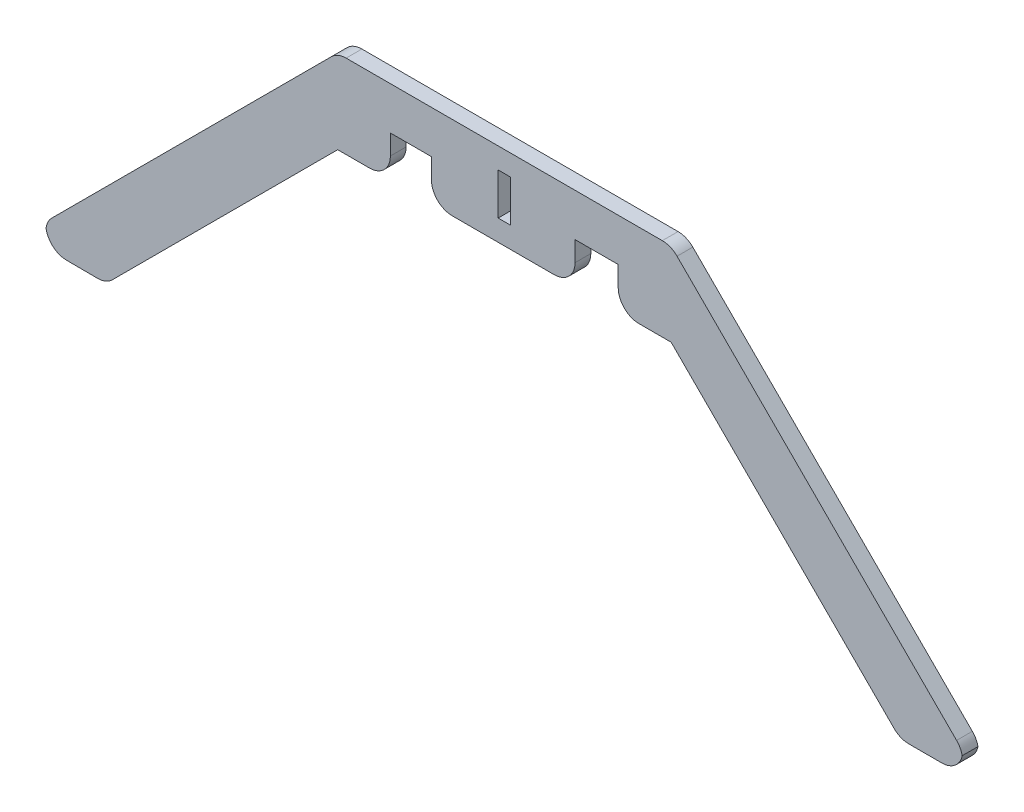
ISO-10303-21;
HEADER;
FILE_DESCRIPTION(('STEP AP214'),'2;1');
FILE_NAME('part.step','',(''),(''),'','','');
FILE_SCHEMA(('AUTOMOTIVE_DESIGN { 1 0 10303 214 1 1 1 1 }'));
ENDSEC;
DATA;
#1=APPLICATION_CONTEXT('core data for automotive mechanical design processes');
#2=APPLICATION_PROTOCOL_DEFINITION('international standard','automotive_design',2000,#1);
#3=PRODUCT_CONTEXT('',#1,'mechanical');
#4=PRODUCT('Part','Part','',(#3));
#5=PRODUCT_RELATED_PRODUCT_CATEGORY('part','',(#4));
#6=PRODUCT_DEFINITION_FORMATION('','',#4);
#7=PRODUCT_DEFINITION_CONTEXT('part definition',#1,'design');
#8=PRODUCT_DEFINITION('design','',#6,#7);
#9=PRODUCT_DEFINITION_SHAPE('','',#8);
#10=(LENGTH_UNIT() NAMED_UNIT(*) SI_UNIT(.MILLI.,.METRE.));
#11=(NAMED_UNIT(*) PLANE_ANGLE_UNIT() SI_UNIT($,.RADIAN.));
#12=(NAMED_UNIT(*) SI_UNIT($,.STERADIAN.) SOLID_ANGLE_UNIT());
#13=UNCERTAINTY_MEASURE_WITH_UNIT(LENGTH_MEASURE(1.E-05),#10,'distance_accuracy_value','');
#14=(GEOMETRIC_REPRESENTATION_CONTEXT(3) GLOBAL_UNCERTAINTY_ASSIGNED_CONTEXT((#13)) GLOBAL_UNIT_ASSIGNED_CONTEXT((#10,
#11,#12)) REPRESENTATION_CONTEXT('',''));
#15=CARTESIAN_POINT('',(0.,0.,0.));
#16=DIRECTION('',(0.,0.,1.));
#17=DIRECTION('',(1.,0.,0.));
#18=AXIS2_PLACEMENT_3D('',#15,#16,#17);
#19=CARTESIAN_POINT('',(0.,0.,4.800000052));
#20=DIRECTION('',(0.,0.,-1.));
#21=DIRECTION('',(-1.,0.,0.));
#22=AXIS2_PLACEMENT_3D('',#19,#20,#21);
#23=PLANE('',#22);
#24=DIRECTION('',(1.,0.,0.));
#25=VECTOR('',#24,1.);
#26=CARTESIAN_POINT('',(0.,143.270265090096,4.800000052));
#27=LINE('',#26,#25);
#28=CARTESIAN_POINT('',(88.9574174696608,143.270265090096,4.800000052));
#29=VERTEX_POINT('',#28);
#30=CARTESIAN_POINT('',(98.6510949411396,143.270265090096,4.800000052));
#31=VERTEX_POINT('',#30);
#32=EDGE_CURVE('E412',#29,#31,#27,.T.);
#33=ORIENTED_EDGE('',*,*,#32,.T.);
#34=CARTESIAN_POINT('',(98.6510949411396,149.620265090096,4.800000052));
#35=DIRECTION('',(0.,0.,-1.));
#36=DIRECTION('',(-1.,0.,0.));
#37=AXIS2_PLACEMENT_3D('',#34,#35,#36);
#38=CIRCLE('',#37,6.35);
#39=CARTESIAN_POINT('',(105.00109494114,149.620265090096,4.800000052));
#40=VERTEX_POINT('',#39);
#41=EDGE_CURVE('E408',#31,#40,#38,.F.);
#42=ORIENTED_EDGE('',*,*,#41,.T.);
#43=DIRECTION('',(0.,1.,0.));
#44=VECTOR('',#43,1.);
#45=CARTESIAN_POINT('',(105.00109494114,0.,4.800000052));
#46=LINE('',#45,#44);
#47=CARTESIAN_POINT('',(105.00109494114,155.712820870524,4.800000052));
#48=VERTEX_POINT('',#47);
#49=EDGE_CURVE('E400',#40,#48,#46,.T.);
#50=ORIENTED_EDGE('',*,*,#49,.T.);
#51=DIRECTION('',(1.,0.,0.));
#52=VECTOR('',#51,1.);
#53=CARTESIAN_POINT('',(0.,155.712820870524,4.800000052));
#54=LINE('',#53,#52);
#55=CARTESIAN_POINT('',(117.513728436182,155.712820870524,4.800000052));
#56=VERTEX_POINT('',#55);
#57=EDGE_CURVE('E406',#48,#56,#54,.T.);
#58=ORIENTED_EDGE('',*,*,#57,.T.);
#59=DIRECTION('',(0.,1.,0.));
#60=VECTOR('',#59,1.);
#61=CARTESIAN_POINT('',(117.513728436182,-1.31068778514753E-13,4.800000052));
#62=LINE('',#61,#60);
#63=CARTESIAN_POINT('',(117.513728436182,149.620265090096,4.800000052));
#64=VERTEX_POINT('',#63);
#65=EDGE_CURVE('E428',#64,#56,#62,.T.);
#66=ORIENTED_EDGE('',*,*,#65,.F.);
#67=CARTESIAN_POINT('',(123.863728436182,149.620265090096,4.800000052));
#68=DIRECTION('',(0.,0.,-1.));
#69=DIRECTION('',(-1.,0.,0.));
#70=AXIS2_PLACEMENT_3D('',#67,#68,#69);
#71=CIRCLE('',#70,6.35);
#72=CARTESIAN_POINT('',(123.863728436182,143.270265090096,4.800000052));
#73=VERTEX_POINT('',#72);
#74=EDGE_CURVE('E589',#64,#73,#71,.F.);
#75=ORIENTED_EDGE('',*,*,#74,.T.);
#76=CARTESIAN_POINT('',(154.93323771039,143.270265090096,4.800000052));
#77=VERTEX_POINT('',#76);
#78=EDGE_CURVE('E430',#73,#77,#27,.T.);
#79=ORIENTED_EDGE('',*,*,#78,.T.);
#80=CARTESIAN_POINT('',(154.93323771039,149.620265090096,4.800000052));
#81=DIRECTION('',(0.,0.,-1.));
#82=DIRECTION('',(-1.,0.,0.));
#83=AXIS2_PLACEMENT_3D('',#80,#81,#82);
#84=CIRCLE('',#83,6.35);
#85=CARTESIAN_POINT('',(161.28323771039,149.620265090096,4.800000052));
#86=VERTEX_POINT('',#85);
#87=EDGE_CURVE('E587',#77,#86,#84,.F.);
#88=ORIENTED_EDGE('',*,*,#87,.T.);
#89=DIRECTION('',(0.,1.,0.));
#90=VECTOR('',#89,1.);
#91=CARTESIAN_POINT('',(161.28323771039,0.,4.800000052));
#92=LINE('',#91,#90);
#93=CARTESIAN_POINT('',(161.28323771039,155.712820870524,4.800000052));
#94=VERTEX_POINT('',#93);
#95=EDGE_CURVE('E434',#86,#94,#92,.T.);
#96=ORIENTED_EDGE('',*,*,#95,.T.);
#97=DIRECTION('',(1.,0.,0.));
#98=VECTOR('',#97,1.);
#99=CARTESIAN_POINT('',(0.,155.712820870524,4.800000052));
#100=LINE('',#99,#98);
#101=CARTESIAN_POINT('',(174.431585666931,155.712820870524,4.800000052));
#102=VERTEX_POINT('',#101);
#103=EDGE_CURVE('E436',#94,#102,#100,.T.);
#104=ORIENTED_EDGE('',*,*,#103,.T.);
#105=DIRECTION('',(0.,1.,0.));
#106=VECTOR('',#105,1.);
#107=CARTESIAN_POINT('',(174.431585666932,3.89104067618317E-13,4.800000052));
#108=LINE('',#107,#106);
#109=CARTESIAN_POINT('',(174.431585666931,149.620265090096,4.800000052));
#110=VERTEX_POINT('',#109);
#111=EDGE_CURVE('E439',#110,#102,#108,.T.);
#112=ORIENTED_EDGE('',*,*,#111,.F.);
#113=CARTESIAN_POINT('',(180.781585666931,149.620265090096,4.800000052));
#114=DIRECTION('',(0.,0.,-1.));
#115=DIRECTION('',(-1.,0.,0.));
#116=AXIS2_PLACEMENT_3D('',#113,#114,#115);
#117=CIRCLE('',#116,6.35);
#118=CARTESIAN_POINT('',(180.781585666931,143.270265090096,4.800000052));
#119=VERTEX_POINT('',#118);
#120=EDGE_CURVE('E585',#110,#119,#117,.F.);
#121=ORIENTED_EDGE('',*,*,#120,.T.);
#122=CARTESIAN_POINT('',(190.557417469661,143.270265090096,4.800000052));
#123=VERTEX_POINT('',#122);
#124=EDGE_CURVE('E441',#119,#123,#27,.T.);
#125=ORIENTED_EDGE('',*,*,#124,.T.);
#126=DIRECTION('',(0.707106781186548,-0.707106781186548,0.));
#127=VECTOR('',#126,1.);
#128=CARTESIAN_POINT('',(166.913841279878,166.913841279878,4.800000052));
#129=LINE('',#128,#127);
#130=CARTESIAN_POINT('',(258.490128060535,75.3375544992219,4.800000052));
#131=VERTEX_POINT('',#130);
#132=EDGE_CURVE('E442',#123,#131,#129,.T.);
#133=ORIENTED_EDGE('',*,*,#132,.T.);
#134=CARTESIAN_POINT('',(262.980256121069,79.8276825597565,4.800000052));
#135=DIRECTION('',(0.,0.,-1.));
#136=DIRECTION('',(-1.,0.,0.));
#137=AXIS2_PLACEMENT_3D('',#134,#135,#136);
#138=CIRCLE('',#137,6.35);
#139=CARTESIAN_POINT('',(262.980256121069,73.4776825597565,4.800000052));
#140=VERTEX_POINT('',#139);
#141=EDGE_CURVE('E583',#131,#140,#138,.F.);
#142=ORIENTED_EDGE('',*,*,#141,.T.);
#143=DIRECTION('',(-1.,0.,0.));
#144=VECTOR('',#143,1.);
#145=CARTESIAN_POINT('',(0.,73.4776825597565,4.800000052));
#146=LINE('',#145,#144);
#147=CARTESIAN_POINT('',(273.05,73.4776825597565,4.800000052));
#148=VERTEX_POINT('',#147);
#149=EDGE_CURVE('E445',#148,#140,#146,.T.);
#150=ORIENTED_EDGE('',*,*,#149,.F.);
#151=CARTESIAN_POINT('',(273.05,79.8276825597565,4.800000052));
#152=DIRECTION('',(0.,0.,-1.));
#153=DIRECTION('',(-1.,0.,0.));
#154=AXIS2_PLACEMENT_3D('',#151,#152,#153);
#155=CIRCLE('',#154,6.35);
#156=CARTESIAN_POINT('',(279.262321481089,78.512554499222,4.800000052));
#157=VERTEX_POINT('',#156);
#158=EDGE_CURVE('E214',#148,#157,#155,.F.);
#159=ORIENTED_EDGE('',*,*,#158,.T.);
#160=CARTESIAN_POINT('',(273.05,77.1974264386875,4.800000052));
#161=DIRECTION('',(0.,0.,-1.));
#162=DIRECTION('',(-1.,0.,0.));
#163=AXIS2_PLACEMENT_3D('',#160,#161,#162);
#164=CIRCLE('',#163,6.35);
#165=CARTESIAN_POINT('',(277.540128060535,81.6875544992221,4.800000052));
#166=VERTEX_POINT('',#165);
#167=EDGE_CURVE('E572',#157,#166,#164,.F.);
#168=ORIENTED_EDGE('',*,*,#167,.T.);
#169=DIRECTION('',(0.707106781186548,-0.707106781186548,0.));
#170=VECTOR('',#169,1.);
#171=CARTESIAN_POINT('',(179.613841279878,179.613841279878,4.800000052));
#172=LINE('',#171,#170);
#173=CARTESIAN_POINT('',(192.359871939465,166.867810620291,4.800000052));
#174=VERTEX_POINT('',#173);
#175=EDGE_CURVE('E526',#174,#166,#172,.T.);
#176=ORIENTED_EDGE('',*,*,#175,.F.);
#177=CARTESIAN_POINT('',(187.869743878931,162.377682559757,4.800000052));
#178=DIRECTION('',(0.,0.,-1.));
#179=DIRECTION('',(-1.,0.,0.));
#180=AXIS2_PLACEMENT_3D('',#177,#178,#179);
#181=CIRCLE('',#180,6.35);
#182=CARTESIAN_POINT('',(187.869743878931,168.727682559757,4.800000052));
#183=VERTEX_POINT('',#182);
#184=EDGE_CURVE('E574',#174,#183,#181,.F.);
#185=ORIENTED_EDGE('',*,*,#184,.T.);
#186=DIRECTION('',(1.,0.,0.));
#187=VECTOR('',#186,1.);
#188=CARTESIAN_POINT('',(0.,168.727682559757,4.800000052));
#189=LINE('',#188,#187);
#190=CARTESIAN_POINT('',(91.5302561210692,168.727682559757,4.800000052));
#191=VERTEX_POINT('',#190);
#192=EDGE_CURVE('E529',#191,#183,#189,.T.);
#193=ORIENTED_EDGE('',*,*,#192,.F.);
#194=CARTESIAN_POINT('',(91.5302561210692,162.377682559757,4.800000052));
#195=DIRECTION('',(0.,0.,-1.));
#196=DIRECTION('',(-1.,0.,0.));
#197=AXIS2_PLACEMENT_3D('',#194,#195,#196);
#198=CIRCLE('',#197,6.35);
#199=CARTESIAN_POINT('',(87.0401280605346,166.867810620291,4.800000052));
#200=VERTEX_POINT('',#199);
#201=EDGE_CURVE('E576',#191,#200,#198,.F.);
#202=ORIENTED_EDGE('',*,*,#201,.T.);
#203=DIRECTION('',(0.707106781186548,0.707106781186547,0.));
#204=VECTOR('',#203,1.);
#205=CARTESIAN_POINT('',(-39.9138412798783,39.9138412798784,4.800000052));
#206=LINE('',#205,#204);
#207=CARTESIAN_POINT('',(1.85987193946544,81.6875544992221,4.800000052));
#208=VERTEX_POINT('',#207);
#209=EDGE_CURVE('E533',#208,#200,#206,.T.);
#210=ORIENTED_EDGE('',*,*,#209,.F.);
#211=CARTESIAN_POINT('',(6.35,77.1974264386875,4.800000052));
#212=DIRECTION('',(0.,0.,-1.));
#213=DIRECTION('',(-1.,0.,0.));
#214=AXIS2_PLACEMENT_3D('',#211,#212,#213);
#215=CIRCLE('',#214,6.35);
#216=CARTESIAN_POINT('',(0.0752751030466065,78.1722738460048,4.800000052));
#217=VERTEX_POINT('',#216);
#218=EDGE_CURVE('E207',#208,#217,#215,.F.);
#219=ORIENTED_EDGE('',*,*,#218,.T.);
#220=CARTESIAN_POINT('',(6.35,79.1471212533221,4.800000052));
#221=DIRECTION('',(0.,0.,-1.));
#222=DIRECTION('',(-1.,0.,0.));
#223=AXIS2_PLACEMENT_3D('',#220,#221,#222);
#224=CIRCLE('',#223,6.35);
#225=CARTESIAN_POINT('',(6.31160561268408,72.7972373275308,4.800000052));
#226=VERTEX_POINT('',#225);
#227=EDGE_CURVE('E579',#217,#226,#224,.F.);
#228=ORIENTED_EDGE('',*,*,#227,.T.);
#229=DIRECTION('',(0.999981720597054,-0.00604636020723104,0.));
#230=VECTOR('',#229,1.);
#231=CARTESIAN_POINT('',(0.440381015797787,72.8327375152234,4.800000052));
#232=LINE('',#231,#230);
#233=CARTESIAN_POINT('',(15.7585027375181,72.7401169405468,4.800000052));
#234=VERTEX_POINT('',#233);
#235=EDGE_CURVE('E448',#226,#234,#232,.T.);
#236=ORIENTED_EDGE('',*,*,#235,.T.);
#237=CARTESIAN_POINT('',(15.796897124834,79.0900008663381,4.800000052));
#238=DIRECTION('',(0.,0.,-1.));
#239=DIRECTION('',(-1.,0.,0.));
#240=AXIS2_PLACEMENT_3D('',#237,#238,#239);
#241=CIRCLE('',#240,6.35);
#242=CARTESIAN_POINT('',(20.2870251853686,74.5998728058035,4.800000052));
#243=VERTEX_POINT('',#242);
#244=EDGE_CURVE('E581',#234,#243,#241,.F.);
#245=ORIENTED_EDGE('',*,*,#244,.T.);
#246=DIRECTION('',(0.707106781186548,0.707106781186548,0.));
#247=VECTOR('',#246,1.);
#248=CARTESIAN_POINT('',(-27.1564238102175,27.1564238102175,4.800000052));
#249=LINE('',#248,#247);
#250=EDGE_CURVE('E423',#243,#29,#249,.T.);
#251=ORIENTED_EDGE('',*,*,#250,.T.);
#252=EDGE_LOOP('',(#33,#42,#50,#58,#66,#75,#79,#88,#96,#104,#112,#121,#125,#133,#142,#150,#159,
#168,#176,#185,#193,#202,#210,#219,#228,#236,#245,#251));
#253=FACE_BOUND('',#252,.T.);
#254=DIRECTION('',(0.,-1.,0.));
#255=VECTOR('',#254,1.);
#256=CARTESIAN_POINT('',(137.852417469661,3.01273480069009E-13,4.800000052));
#257=LINE('',#256,#255);
#258=CARTESIAN_POINT('',(137.852417469661,162.377682559757,4.800000052));
#259=VERTEX_POINT('',#258);
#260=CARTESIAN_POINT('',(137.852417469661,149.677682559757,4.800000052));
#261=VERTEX_POINT('',#260);
#262=EDGE_CURVE('E495',#259,#261,#257,.T.);
#263=ORIENTED_EDGE('',*,*,#262,.F.);
#264=DIRECTION('',(-1.,0.,0.));
#265=VECTOR('',#264,1.);
#266=CARTESIAN_POINT('',(0.,162.377682559757,4.800000052));
#267=LINE('',#266,#265);
#268=CARTESIAN_POINT('',(141.662417469661,162.377682559757,4.800000052));
#269=VERTEX_POINT('',#268);
#270=EDGE_CURVE('E497',#269,#259,#267,.T.);
#271=ORIENTED_EDGE('',*,*,#270,.F.);
#272=DIRECTION('',(0.,-1.,0.));
#273=VECTOR('',#272,1.);
#274=CARTESIAN_POINT('',(141.662417469661,0.,4.800000052));
#275=LINE('',#274,#273);
#276=CARTESIAN_POINT('',(141.662417469661,149.677682559757,4.800000052));
#277=VERTEX_POINT('',#276);
#278=EDGE_CURVE('E500',#269,#277,#275,.T.);
#279=ORIENTED_EDGE('',*,*,#278,.T.);
#280=DIRECTION('',(-1.,0.,0.));
#281=VECTOR('',#280,1.);
#282=CARTESIAN_POINT('',(0.,149.677682559757,4.800000052));
#283=LINE('',#282,#281);
#284=EDGE_CURVE('E503',#277,#261,#283,.T.);
#285=ORIENTED_EDGE('',*,*,#284,.T.);
#286=EDGE_LOOP('',(#263,#271,#279,#285));
#287=FACE_BOUND('',#286,.T.);
#288=ADVANCED_FACE('F190',(#253,#287),#23,.F.);
#289=CARTESIAN_POINT('',(0.,0.,0.));
#290=DIRECTION('',(0.,0.,-1.));
#291=DIRECTION('',(-1.,0.,0.));
#292=AXIS2_PLACEMENT_3D('',#289,#290,#291);
#293=PLANE('',#292);
#294=DIRECTION('',(0.,1.,0.));
#295=VECTOR('',#294,1.);
#296=CARTESIAN_POINT('',(105.00109494114,0.,0.));
#297=LINE('',#296,#295);
#298=CARTESIAN_POINT('',(105.00109494114,149.620265090096,0.));
#299=VERTEX_POINT('',#298);
#300=CARTESIAN_POINT('',(105.00109494114,155.712820870524,0.));
#301=VERTEX_POINT('',#300);
#302=EDGE_CURVE('E418',#299,#301,#297,.T.);
#303=ORIENTED_EDGE('',*,*,#302,.F.);
#304=CARTESIAN_POINT('',(98.6510949411396,149.620265090096,0.));
#305=DIRECTION('',(0.,0.,-1.));
#306=DIRECTION('',(-1.,0.,0.));
#307=AXIS2_PLACEMENT_3D('',#304,#305,#306);
#308=CIRCLE('',#307,6.35);
#309=CARTESIAN_POINT('',(98.6510949411396,143.270265090096,0.));
#310=VERTEX_POINT('',#309);
#311=EDGE_CURVE('E567',#299,#310,#308,.T.);
#312=ORIENTED_EDGE('',*,*,#311,.T.);
#313=DIRECTION('',(1.,0.,0.));
#314=VECTOR('',#313,1.);
#315=CARTESIAN_POINT('',(0.,143.270265090096,0.));
#316=LINE('',#315,#314);
#317=CARTESIAN_POINT('',(88.9574174696608,143.270265090096,0.));
#318=VERTEX_POINT('',#317);
#319=EDGE_CURVE('E452',#318,#310,#316,.T.);
#320=ORIENTED_EDGE('',*,*,#319,.F.);
#321=DIRECTION('',(0.707106781186548,0.707106781186548,0.));
#322=VECTOR('',#321,1.);
#323=CARTESIAN_POINT('',(-27.1564238102175,27.1564238102175,0.));
#324=LINE('',#323,#322);
#325=CARTESIAN_POINT('',(20.2870251853686,74.5998728058035,0.));
#326=VERTEX_POINT('',#325);
#327=EDGE_CURVE('E479',#326,#318,#324,.T.);
#328=ORIENTED_EDGE('',*,*,#327,.F.);
#329=CARTESIAN_POINT('',(15.796897124834,79.0900008663381,0.));
#330=DIRECTION('',(0.,0.,-1.));
#331=DIRECTION('',(-1.,0.,0.));
#332=AXIS2_PLACEMENT_3D('',#329,#330,#331);
#333=CIRCLE('',#332,6.35);
#334=CARTESIAN_POINT('',(15.7585027375181,72.7401169405468,0.));
#335=VERTEX_POINT('',#334);
#336=EDGE_CURVE('E557',#326,#335,#333,.T.);
#337=ORIENTED_EDGE('',*,*,#336,.T.);
#338=DIRECTION('',(0.999981720597054,-0.00604636020723104,0.));
#339=VECTOR('',#338,1.);
#340=CARTESIAN_POINT('',(0.440381015797787,72.8327375152234,0.));
#341=LINE('',#340,#339);
#342=CARTESIAN_POINT('',(6.31160561268408,72.7972373275308,0.));
#343=VERTEX_POINT('',#342);
#344=EDGE_CURVE('E476',#343,#335,#341,.T.);
#345=ORIENTED_EDGE('',*,*,#344,.F.);
#346=CARTESIAN_POINT('',(6.35,79.1471212533221,0.));
#347=DIRECTION('',(0.,0.,-1.));
#348=DIRECTION('',(-1.,0.,0.));
#349=AXIS2_PLACEMENT_3D('',#346,#347,#348);
#350=CIRCLE('',#349,6.35);
#351=CARTESIAN_POINT('',(0.0752751030466065,78.1722738460048,0.));
#352=VERTEX_POINT('',#351);
#353=EDGE_CURVE('E555',#343,#352,#350,.T.);
#354=ORIENTED_EDGE('',*,*,#353,.T.);
#355=CARTESIAN_POINT('',(6.35,77.1974264386875,0.));
#356=DIRECTION('',(0.,0.,-1.));
#357=DIRECTION('',(-1.,0.,0.));
#358=AXIS2_PLACEMENT_3D('',#355,#356,#357);
#359=CIRCLE('',#358,6.35);
#360=CARTESIAN_POINT('',(1.85987193946544,81.6875544992221,0.));
#361=VERTEX_POINT('',#360);
#362=EDGE_CURVE('E553',#352,#361,#359,.T.);
#363=ORIENTED_EDGE('',*,*,#362,.T.);
#364=DIRECTION('',(0.707106781186548,0.707106781186547,0.));
#365=VECTOR('',#364,1.);
#366=CARTESIAN_POINT('',(-39.9138412798783,39.9138412798784,0.));
#367=LINE('',#366,#365);
#368=CARTESIAN_POINT('',(87.0401280605346,166.867810620291,0.));
#369=VERTEX_POINT('',#368);
#370=EDGE_CURVE('E530',#361,#369,#367,.T.);
#371=ORIENTED_EDGE('',*,*,#370,.T.);
#372=CARTESIAN_POINT('',(91.5302561210692,162.377682559757,0.));
#373=DIRECTION('',(0.,0.,-1.));
#374=DIRECTION('',(-1.,0.,0.));
#375=AXIS2_PLACEMENT_3D('',#372,#373,#374);
#376=CIRCLE('',#375,6.35);
#377=CARTESIAN_POINT('',(91.5302561210692,168.727682559757,0.));
#378=VERTEX_POINT('',#377);
#379=EDGE_CURVE('E551',#369,#378,#376,.T.);
#380=ORIENTED_EDGE('',*,*,#379,.T.);
#381=DIRECTION('',(1.,0.,0.));
#382=VECTOR('',#381,1.);
#383=CARTESIAN_POINT('',(0.,168.727682559757,0.));
#384=LINE('',#383,#382);
#385=CARTESIAN_POINT('',(187.869743878931,168.727682559757,0.));
#386=VERTEX_POINT('',#385);
#387=EDGE_CURVE('E539',#378,#386,#384,.T.);
#388=ORIENTED_EDGE('',*,*,#387,.T.);
#389=CARTESIAN_POINT('',(187.869743878931,162.377682559757,0.));
#390=DIRECTION('',(0.,0.,-1.));
#391=DIRECTION('',(-1.,0.,0.));
#392=AXIS2_PLACEMENT_3D('',#389,#390,#391);
#393=CIRCLE('',#392,6.35);
#394=CARTESIAN_POINT('',(192.359871939465,166.867810620291,0.));
#395=VERTEX_POINT('',#394);
#396=EDGE_CURVE('E549',#386,#395,#393,.T.);
#397=ORIENTED_EDGE('',*,*,#396,.T.);
#398=DIRECTION('',(0.707106781186548,-0.707106781186548,0.));
#399=VECTOR('',#398,1.);
#400=CARTESIAN_POINT('',(179.613841279878,179.613841279878,0.));
#401=LINE('',#400,#399);
#402=CARTESIAN_POINT('',(277.540128060535,81.6875544992221,0.));
#403=VERTEX_POINT('',#402);
#404=EDGE_CURVE('E519',#395,#403,#401,.T.);
#405=ORIENTED_EDGE('',*,*,#404,.T.);
#406=CARTESIAN_POINT('',(273.05,77.1974264386875,0.));
#407=DIRECTION('',(0.,0.,-1.));
#408=DIRECTION('',(-1.,0.,0.));
#409=AXIS2_PLACEMENT_3D('',#406,#407,#408);
#410=CIRCLE('',#409,6.35);
#411=CARTESIAN_POINT('',(279.262321481089,78.512554499222,0.));
#412=VERTEX_POINT('',#411);
#413=EDGE_CURVE('E547',#403,#412,#410,.T.);
#414=ORIENTED_EDGE('',*,*,#413,.T.);
#415=CARTESIAN_POINT('',(273.05,79.8276825597565,0.));
#416=DIRECTION('',(0.,0.,-1.));
#417=DIRECTION('',(-1.,0.,0.));
#418=AXIS2_PLACEMENT_3D('',#415,#416,#417);
#419=CIRCLE('',#418,6.35);
#420=CARTESIAN_POINT('',(273.05,73.4776825597565,0.));
#421=VERTEX_POINT('',#420);
#422=EDGE_CURVE('E545',#412,#421,#419,.T.);
#423=ORIENTED_EDGE('',*,*,#422,.T.);
#424=DIRECTION('',(-1.,0.,0.));
#425=VECTOR('',#424,1.);
#426=CARTESIAN_POINT('',(0.,73.4776825597565,0.));
#427=LINE('',#426,#425);
#428=CARTESIAN_POINT('',(262.980256121069,73.4776825597565,0.));
#429=VERTEX_POINT('',#428);
#430=EDGE_CURVE('E473',#421,#429,#427,.T.);
#431=ORIENTED_EDGE('',*,*,#430,.T.);
#432=CARTESIAN_POINT('',(262.980256121069,79.8276825597565,0.));
#433=DIRECTION('',(0.,0.,-1.));
#434=DIRECTION('',(-1.,0.,0.));
#435=AXIS2_PLACEMENT_3D('',#432,#433,#434);
#436=CIRCLE('',#435,6.35);
#437=CARTESIAN_POINT('',(258.490128060535,75.3375544992219,0.));
#438=VERTEX_POINT('',#437);
#439=EDGE_CURVE('E559',#429,#438,#436,.T.);
#440=ORIENTED_EDGE('',*,*,#439,.T.);
#441=DIRECTION('',(0.707106781186548,-0.707106781186548,0.));
#442=VECTOR('',#441,1.);
#443=CARTESIAN_POINT('',(166.913841279878,166.913841279878,0.));
#444=LINE('',#443,#442);
#445=CARTESIAN_POINT('',(190.557417469661,143.270265090096,0.));
#446=VERTEX_POINT('',#445);
#447=EDGE_CURVE('E470',#446,#438,#444,.T.);
#448=ORIENTED_EDGE('',*,*,#447,.F.);
#449=CARTESIAN_POINT('',(180.781585666931,143.270265090096,0.));
#450=VERTEX_POINT('',#449);
#451=EDGE_CURVE('E457',#450,#446,#316,.T.);
#452=ORIENTED_EDGE('',*,*,#451,.F.);
#453=CARTESIAN_POINT('',(180.781585666931,149.620265090096,0.));
#454=DIRECTION('',(0.,0.,-1.));
#455=DIRECTION('',(-1.,0.,0.));
#456=AXIS2_PLACEMENT_3D('',#453,#454,#455);
#457=CIRCLE('',#456,6.35);
#458=CARTESIAN_POINT('',(174.431585666931,149.620265090096,0.));
#459=VERTEX_POINT('',#458);
#460=EDGE_CURVE('E561',#450,#459,#457,.T.);
#461=ORIENTED_EDGE('',*,*,#460,.T.);
#462=DIRECTION('',(0.,1.,0.));
#463=VECTOR('',#462,1.);
#464=CARTESIAN_POINT('',(174.431585666932,3.89104067618317E-13,0.));
#465=LINE('',#464,#463);
#466=CARTESIAN_POINT('',(174.431585666931,155.712820870524,0.));
#467=VERTEX_POINT('',#466);
#468=EDGE_CURVE('E468',#459,#467,#465,.T.);
#469=ORIENTED_EDGE('',*,*,#468,.T.);
#470=DIRECTION('',(1.,0.,0.));
#471=VECTOR('',#470,1.);
#472=CARTESIAN_POINT('',(0.,155.712820870524,0.));
#473=LINE('',#472,#471);
#474=CARTESIAN_POINT('',(161.28323771039,155.712820870524,0.));
#475=VERTEX_POINT('',#474);
#476=EDGE_CURVE('E465',#475,#467,#473,.T.);
#477=ORIENTED_EDGE('',*,*,#476,.F.);
#478=DIRECTION('',(0.,1.,0.));
#479=VECTOR('',#478,1.);
#480=CARTESIAN_POINT('',(161.28323771039,0.,0.));
#481=LINE('',#480,#479);
#482=CARTESIAN_POINT('',(161.28323771039,149.620265090096,0.));
#483=VERTEX_POINT('',#482);
#484=EDGE_CURVE('E463',#483,#475,#481,.T.);
#485=ORIENTED_EDGE('',*,*,#484,.F.);
#486=CARTESIAN_POINT('',(154.93323771039,149.620265090096,0.));
#487=DIRECTION('',(0.,0.,-1.));
#488=DIRECTION('',(-1.,0.,0.));
#489=AXIS2_PLACEMENT_3D('',#486,#487,#488);
#490=CIRCLE('',#489,6.35);
#491=CARTESIAN_POINT('',(154.93323771039,143.270265090096,0.));
#492=VERTEX_POINT('',#491);
#493=EDGE_CURVE('E563',#483,#492,#490,.T.);
#494=ORIENTED_EDGE('',*,*,#493,.T.);
#495=CARTESIAN_POINT('',(123.863728436182,143.270265090096,0.));
#496=VERTEX_POINT('',#495);
#497=EDGE_CURVE('E456',#496,#492,#316,.T.);
#498=ORIENTED_EDGE('',*,*,#497,.F.);
#499=CARTESIAN_POINT('',(123.863728436182,149.620265090096,0.));
#500=DIRECTION('',(0.,0.,-1.));
#501=DIRECTION('',(-1.,0.,0.));
#502=AXIS2_PLACEMENT_3D('',#499,#500,#501);
#503=CIRCLE('',#502,6.35);
#504=CARTESIAN_POINT('',(117.513728436182,149.620265090096,0.));
#505=VERTEX_POINT('',#504);
#506=EDGE_CURVE('E565',#496,#505,#503,.T.);
#507=ORIENTED_EDGE('',*,*,#506,.T.);
#508=DIRECTION('',(0.,1.,0.));
#509=VECTOR('',#508,1.);
#510=CARTESIAN_POINT('',(117.513728436182,-1.31068778514753E-13,0.));
#511=LINE('',#510,#509);
#512=CARTESIAN_POINT('',(117.513728436182,155.712820870524,0.));
#513=VERTEX_POINT('',#512);
#514=EDGE_CURVE('E461',#505,#513,#511,.T.);
#515=ORIENTED_EDGE('',*,*,#514,.T.);
#516=DIRECTION('',(1.,0.,0.));
#517=VECTOR('',#516,1.);
#518=CARTESIAN_POINT('',(0.,155.712820870524,0.));
#519=LINE('',#518,#517);
#520=EDGE_CURVE('E459',#301,#513,#519,.T.);
#521=ORIENTED_EDGE('',*,*,#520,.F.);
#522=EDGE_LOOP('',(#303,#312,#320,#328,#337,#345,#354,#363,#371,#380,#388,#397,#405,#414,#423,
#431,#440,#448,#452,#461,#469,#477,#485,#494,#498,#507,#515,#521));
#523=FACE_BOUND('',#522,.T.);
#524=DIRECTION('',(-1.,0.,0.));
#525=VECTOR('',#524,1.);
#526=CARTESIAN_POINT('',(0.,162.377682559757,0.));
#527=LINE('',#526,#525);
#528=CARTESIAN_POINT('',(141.662417469661,162.377682559757,0.));
#529=VERTEX_POINT('',#528);
#530=CARTESIAN_POINT('',(137.852417469661,162.377682559757,0.));
#531=VERTEX_POINT('',#530);
#532=EDGE_CURVE('E509',#529,#531,#527,.T.);
#533=ORIENTED_EDGE('',*,*,#532,.T.);
#534=DIRECTION('',(0.,-1.,0.));
#535=VECTOR('',#534,1.);
#536=CARTESIAN_POINT('',(137.852417469661,3.01273480069009E-13,0.));
#537=LINE('',#536,#535);
#538=CARTESIAN_POINT('',(137.852417469661,149.677682559757,0.));
#539=VERTEX_POINT('',#538);
#540=EDGE_CURVE('E484',#531,#539,#537,.T.);
#541=ORIENTED_EDGE('',*,*,#540,.T.);
#542=DIRECTION('',(-1.,0.,0.));
#543=VECTOR('',#542,1.);
#544=CARTESIAN_POINT('',(0.,149.677682559757,0.));
#545=LINE('',#544,#543);
#546=CARTESIAN_POINT('',(141.662417469661,149.677682559757,0.));
#547=VERTEX_POINT('',#546);
#548=EDGE_CURVE('E498',#547,#539,#545,.T.);
#549=ORIENTED_EDGE('',*,*,#548,.F.);
#550=DIRECTION('',(0.,-1.,0.));
#551=VECTOR('',#550,1.);
#552=CARTESIAN_POINT('',(141.662417469661,0.,0.));
#553=LINE('',#552,#551);
#554=EDGE_CURVE('E512',#529,#547,#553,.T.);
#555=ORIENTED_EDGE('',*,*,#554,.F.);
#556=EDGE_LOOP('',(#533,#541,#549,#555));
#557=FACE_BOUND('',#556,.T.);
#558=ADVANCED_FACE('F646',(#523,#557),#293,.T.);
#559=CARTESIAN_POINT('',(179.613841279878,179.613841279878,4.800000052));
#560=DIRECTION('',(0.707106781186548,0.707106781186548,0.));
#561=DIRECTION('',(-0.707106781186548,0.707106781186548,0.));
#562=AXIS2_PLACEMENT_3D('',#559,#560,#561);
#563=PLANE('',#562);
#564=ORIENTED_EDGE('',*,*,#404,.F.);
#565=DIRECTION('',(0.,0.,-1.));
#566=VECTOR('',#565,1.);
#567=CARTESIAN_POINT('',(192.359871939465,166.867810620291,4.800000052));
#568=LINE('',#567,#566);
#569=EDGE_CURVE('E12',#395,#174,#568,.F.);
#570=ORIENTED_EDGE('',*,*,#569,.T.);
#571=ORIENTED_EDGE('',*,*,#175,.T.);
#572=DIRECTION('',(0.,0.,-1.));
#573=VECTOR('',#572,1.);
#574=CARTESIAN_POINT('',(277.540128060535,81.6875544992221,0.));
#575=LINE('',#574,#573);
#576=EDGE_CURVE('E199',#166,#403,#575,.T.);
#577=ORIENTED_EDGE('',*,*,#576,.T.);
#578=EDGE_LOOP('',(#564,#570,#571,#577));
#579=FACE_BOUND('',#578,.T.);
#580=ADVANCED_FACE('F709',(#579),#563,.T.);
#581=CARTESIAN_POINT('',(-39.9138412798783,39.9138412798784,4.800000052));
#582=DIRECTION('',(-0.707106781186547,0.707106781186548,0.));
#583=DIRECTION('',(-0.707106781186548,-0.707106781186547,0.));
#584=AXIS2_PLACEMENT_3D('',#581,#582,#583);
#585=PLANE('',#584);
#586=ORIENTED_EDGE('',*,*,#370,.F.);
#587=DIRECTION('',(0.,0.,-1.));
#588=VECTOR('',#587,1.);
#589=CARTESIAN_POINT('',(1.85987193946542,81.6875544992221,4.800000052));
#590=LINE('',#589,#588);
#591=EDGE_CURVE('E625',#361,#208,#590,.F.);
#592=ORIENTED_EDGE('',*,*,#591,.T.);
#593=ORIENTED_EDGE('',*,*,#209,.T.);
#594=DIRECTION('',(0.,0.,-1.));
#595=VECTOR('',#594,1.);
#596=CARTESIAN_POINT('',(87.0401280605346,166.867810620291,4.800000052));
#597=LINE('',#596,#595);
#598=EDGE_CURVE('E622',#200,#369,#597,.T.);
#599=ORIENTED_EDGE('',*,*,#598,.T.);
#600=EDGE_LOOP('',(#586,#592,#593,#599));
#601=FACE_BOUND('',#600,.T.);
#602=ADVANCED_FACE('F978',(#601),#585,.T.);
#603=CARTESIAN_POINT('',(0.,168.727682559757,4.800000052));
#604=DIRECTION('',(0.,1.,0.));
#605=DIRECTION('',(-1.,0.,0.));
#606=AXIS2_PLACEMENT_3D('',#603,#604,#605);
#607=PLANE('',#606);
#608=ORIENTED_EDGE('',*,*,#387,.F.);
#609=DIRECTION('',(0.,0.,-1.));
#610=VECTOR('',#609,1.);
#611=CARTESIAN_POINT('',(91.5302561210692,168.727682559757,4.800000052));
#612=LINE('',#611,#610);
#613=EDGE_CURVE('E630',#378,#191,#612,.F.);
#614=ORIENTED_EDGE('',*,*,#613,.T.);
#615=ORIENTED_EDGE('',*,*,#192,.T.);
#616=DIRECTION('',(0.,0.,-1.));
#617=VECTOR('',#616,1.);
#618=CARTESIAN_POINT('',(187.869743878931,168.727682559757,4.800000052));
#619=LINE('',#618,#617);
#620=EDGE_CURVE('E627',#183,#386,#619,.T.);
#621=ORIENTED_EDGE('',*,*,#620,.T.);
#622=EDGE_LOOP('',(#608,#614,#615,#621));
#623=FACE_BOUND('',#622,.T.);
#624=ADVANCED_FACE('F968',(#623),#607,.T.);
#625=CARTESIAN_POINT('',(0.,143.270265090096,4.800000052));
#626=DIRECTION('',(0.,1.,0.));
#627=DIRECTION('',(0.,0.,1.));
#628=AXIS2_PLACEMENT_3D('',#625,#626,#627);
#629=PLANE('',#628);
#630=ORIENTED_EDGE('',*,*,#319,.T.);
#631=DIRECTION('',(0.,0.,-1.));
#632=VECTOR('',#631,1.);
#633=CARTESIAN_POINT('',(98.6510949411396,143.270265090096,4.800000052));
#634=LINE('',#633,#632);
#635=EDGE_CURVE('E569',#310,#31,#634,.F.);
#636=ORIENTED_EDGE('',*,*,#635,.T.);
#637=ORIENTED_EDGE('',*,*,#32,.F.);
#638=DIRECTION('',(0.,0.,-1.));
#639=VECTOR('',#638,1.);
#640=CARTESIAN_POINT('',(88.9574174696608,143.270265090096,4.800000052));
#641=LINE('',#640,#639);
#642=EDGE_CURVE('E481',#29,#318,#641,.T.);
#643=ORIENTED_EDGE('',*,*,#642,.T.);
#644=EDGE_LOOP('',(#630,#636,#637,#643));
#645=FACE_BOUND('',#644,.T.);
#646=ADVANCED_FACE('F703',(#645),#629,.F.);
#647=CARTESIAN_POINT('',(-27.1564238102175,27.1564238102175,4.800000052));
#648=DIRECTION('',(-0.707106781186548,0.707106781186548,0.));
#649=DIRECTION('',(-0.707106781186548,-0.707106781186548,0.));
#650=AXIS2_PLACEMENT_3D('',#647,#648,#649);
#651=PLANE('',#650);
#652=ORIENTED_EDGE('',*,*,#250,.F.);
#653=DIRECTION('',(0.,0.,-1.));
#654=VECTOR('',#653,1.);
#655=CARTESIAN_POINT('',(20.2870251853686,74.5998728058035,4.800000052));
#656=LINE('',#655,#654);
#657=EDGE_CURVE('E614',#243,#326,#656,.T.);
#658=ORIENTED_EDGE('',*,*,#657,.T.);
#659=ORIENTED_EDGE('',*,*,#327,.T.);
#660=ORIENTED_EDGE('',*,*,#642,.F.);
#661=EDGE_LOOP('',(#652,#658,#659,#660));
#662=FACE_BOUND('',#661,.T.);
#663=ADVANCED_FACE('F949',(#662),#651,.F.);
#664=CARTESIAN_POINT('',(0.440381015797787,72.8327375152234,4.800000052));
#665=DIRECTION('',(0.00604636020723104,0.999981720597054,0.));
#666=DIRECTION('',(-0.999981720597054,0.00604636020723104,0.));
#667=AXIS2_PLACEMENT_3D('',#664,#665,#666);
#668=PLANE('',#667);
#669=ORIENTED_EDGE('',*,*,#344,.T.);
#670=DIRECTION('',(0.,0.,-1.));
#671=VECTOR('',#670,1.);
#672=CARTESIAN_POINT('',(15.7585027375181,72.7401169405468,4.800000052));
#673=LINE('',#672,#671);
#674=EDGE_CURVE('E620',#335,#234,#673,.F.);
#675=ORIENTED_EDGE('',*,*,#674,.T.);
#676=ORIENTED_EDGE('',*,*,#235,.F.);
#677=DIRECTION('',(0.,0.,-1.));
#678=VECTOR('',#677,1.);
#679=CARTESIAN_POINT('',(6.31160561268408,72.7972373275308,4.800000052));
#680=LINE('',#679,#678);
#681=EDGE_CURVE('E617',#226,#343,#680,.T.);
#682=ORIENTED_EDGE('',*,*,#681,.T.);
#683=EDGE_LOOP('',(#669,#675,#676,#682));
#684=FACE_BOUND('',#683,.T.);
#685=ADVANCED_FACE('F940',(#684),#668,.F.);
#686=CARTESIAN_POINT('',(0.,73.4776825597565,4.800000052));
#687=DIRECTION('',(0.,-1.,0.));
#688=DIRECTION('',(0.,0.,-1.));
#689=AXIS2_PLACEMENT_3D('',#686,#687,#688);
#690=PLANE('',#689);
#691=ORIENTED_EDGE('',*,*,#149,.T.);
#692=DIRECTION('',(0.,0.,-1.));
#693=VECTOR('',#692,1.);
#694=CARTESIAN_POINT('',(262.980256121069,73.4776825597565,0.));
#695=LINE('',#694,#693);
#696=EDGE_CURVE('E609',#140,#429,#695,.T.);
#697=ORIENTED_EDGE('',*,*,#696,.T.);
#698=ORIENTED_EDGE('',*,*,#430,.F.);
#699=DIRECTION('',(0.,0.,-1.));
#700=VECTOR('',#699,1.);
#701=CARTESIAN_POINT('',(273.05,73.4776825597565,4.800000052));
#702=LINE('',#701,#700);
#703=EDGE_CURVE('E607',#421,#148,#702,.F.);
#704=ORIENTED_EDGE('',*,*,#703,.T.);
#705=EDGE_LOOP('',(#691,#697,#698,#704));
#706=FACE_BOUND('',#705,.T.);
#707=ADVANCED_FACE('F649',(#706),#690,.T.);
#708=CARTESIAN_POINT('',(166.913841279878,166.913841279878,4.800000052));
#709=DIRECTION('',(0.707106781186548,0.707106781186548,0.));
#710=DIRECTION('',(-0.707106781186548,0.707106781186548,0.));
#711=AXIS2_PLACEMENT_3D('',#708,#709,#710);
#712=PLANE('',#711);
#713=ORIENTED_EDGE('',*,*,#447,.T.);
#714=DIRECTION('',(0.,0.,-1.));
#715=VECTOR('',#714,1.);
#716=CARTESIAN_POINT('',(258.490128060535,75.3375544992219,4.800000052));
#717=LINE('',#716,#715);
#718=EDGE_CURVE('E612',#438,#131,#717,.F.);
#719=ORIENTED_EDGE('',*,*,#718,.T.);
#720=ORIENTED_EDGE('',*,*,#132,.F.);
#721=DIRECTION('',(0.,0.,-1.));
#722=VECTOR('',#721,1.);
#723=CARTESIAN_POINT('',(190.557417469661,143.270265090096,4.800000052));
#724=LINE('',#723,#722);
#725=EDGE_CURVE('E485',#123,#446,#724,.T.);
#726=ORIENTED_EDGE('',*,*,#725,.T.);
#727=EDGE_LOOP('',(#713,#719,#720,#726));
#728=FACE_BOUND('',#727,.T.);
#729=ADVANCED_FACE('F658',(#728),#712,.F.);
#730=ORIENTED_EDGE('',*,*,#124,.F.);
#731=DIRECTION('',(0.,0.,-1.));
#732=VECTOR('',#731,1.);
#733=CARTESIAN_POINT('',(180.781585666931,143.270265090096,0.));
#734=LINE('',#733,#732);
#735=EDGE_CURVE('E602',#119,#450,#734,.T.);
#736=ORIENTED_EDGE('',*,*,#735,.T.);
#737=ORIENTED_EDGE('',*,*,#451,.T.);
#738=ORIENTED_EDGE('',*,*,#725,.F.);
#739=EDGE_LOOP('',(#730,#736,#737,#738));
#740=FACE_BOUND('',#739,.T.);
#741=ADVANCED_FACE('F663',(#740),#629,.F.);
#742=CARTESIAN_POINT('',(174.431585666932,3.89104067618317E-13,4.800000052));
#743=DIRECTION('',(-1.,0.,0.));
#744=DIRECTION('',(0.,-1.,0.));
#745=AXIS2_PLACEMENT_3D('',#742,#743,#744);
#746=PLANE('',#745);
#747=ORIENTED_EDGE('',*,*,#468,.F.);
#748=DIRECTION('',(0.,0.,-1.));
#749=VECTOR('',#748,1.);
#750=CARTESIAN_POINT('',(174.431585666931,149.620265090096,4.800000052));
#751=LINE('',#750,#749);
#752=EDGE_CURVE('E605',#459,#110,#751,.F.);
#753=ORIENTED_EDGE('',*,*,#752,.T.);
#754=ORIENTED_EDGE('',*,*,#111,.T.);
#755=DIRECTION('',(0.,0.,-1.));
#756=VECTOR('',#755,1.);
#757=CARTESIAN_POINT('',(174.431585666931,155.712820870524,4.800000052));
#758=LINE('',#757,#756);
#759=EDGE_CURVE('E488',#102,#467,#758,.T.);
#760=ORIENTED_EDGE('',*,*,#759,.T.);
#761=EDGE_LOOP('',(#747,#753,#754,#760));
#762=FACE_BOUND('',#761,.T.);
#763=ADVANCED_FACE('F694',(#762),#746,.T.);
#764=CARTESIAN_POINT('',(0.,155.712820870524,4.800000052));
#765=DIRECTION('',(0.,1.,0.));
#766=DIRECTION('',(0.,0.,1.));
#767=AXIS2_PLACEMENT_3D('',#764,#765,#766);
#768=PLANE('',#767);
#769=ORIENTED_EDGE('',*,*,#476,.T.);
#770=ORIENTED_EDGE('',*,*,#759,.F.);
#771=ORIENTED_EDGE('',*,*,#103,.F.);
#772=DIRECTION('',(0.,0.,-1.));
#773=VECTOR('',#772,1.);
#774=CARTESIAN_POINT('',(161.28323771039,155.712820870524,4.800000052));
#775=LINE('',#774,#773);
#776=EDGE_CURVE('E491',#94,#475,#775,.T.);
#777=ORIENTED_EDGE('',*,*,#776,.T.);
#778=EDGE_LOOP('',(#769,#770,#771,#777));
#779=FACE_BOUND('',#778,.T.);
#780=ADVANCED_FACE('F686',(#779),#768,.F.);
#781=CARTESIAN_POINT('',(161.28323771039,0.,4.800000052));
#782=DIRECTION('',(-1.,0.,0.));
#783=DIRECTION('',(0.,0.,1.));
#784=AXIS2_PLACEMENT_3D('',#781,#782,#783);
#785=PLANE('',#784);
#786=ORIENTED_EDGE('',*,*,#95,.F.);
#787=DIRECTION('',(0.,0.,-1.));
#788=VECTOR('',#787,1.);
#789=CARTESIAN_POINT('',(161.28323771039,149.620265090096,4.800000052));
#790=LINE('',#789,#788);
#791=EDGE_CURVE('E599',#86,#483,#790,.T.);
#792=ORIENTED_EDGE('',*,*,#791,.T.);
#793=ORIENTED_EDGE('',*,*,#484,.T.);
#794=ORIENTED_EDGE('',*,*,#776,.F.);
#795=EDGE_LOOP('',(#786,#792,#793,#794));
#796=FACE_BOUND('',#795,.T.);
#797=ADVANCED_FACE('F680',(#796),#785,.F.);
#798=ORIENTED_EDGE('',*,*,#78,.F.);
#799=DIRECTION('',(0.,0.,-1.));
#800=VECTOR('',#799,1.);
#801=CARTESIAN_POINT('',(123.863728436182,143.270265090096,0.));
#802=LINE('',#801,#800);
#803=EDGE_CURVE('E594',#73,#496,#802,.T.);
#804=ORIENTED_EDGE('',*,*,#803,.T.);
#805=ORIENTED_EDGE('',*,*,#497,.T.);
#806=DIRECTION('',(0.,0.,-1.));
#807=VECTOR('',#806,1.);
#808=CARTESIAN_POINT('',(154.93323771039,143.270265090096,4.800000052));
#809=LINE('',#808,#807);
#810=EDGE_CURVE('E592',#492,#77,#809,.F.);
#811=ORIENTED_EDGE('',*,*,#810,.T.);
#812=EDGE_LOOP('',(#798,#804,#805,#811));
#813=FACE_BOUND('',#812,.T.);
#814=ADVANCED_FACE('F670',(#813),#629,.F.);
#815=CARTESIAN_POINT('',(117.513728436182,-1.31068778514753E-13,4.800000052));
#816=DIRECTION('',(-1.,0.,0.));
#817=DIRECTION('',(0.,-1.,0.));
#818=AXIS2_PLACEMENT_3D('',#815,#816,#817);
#819=PLANE('',#818);
#820=ORIENTED_EDGE('',*,*,#514,.F.);
#821=DIRECTION('',(0.,0.,-1.));
#822=VECTOR('',#821,1.);
#823=CARTESIAN_POINT('',(117.513728436182,149.620265090096,4.800000052));
#824=LINE('',#823,#822);
#825=EDGE_CURVE('E597',#505,#64,#824,.F.);
#826=ORIENTED_EDGE('',*,*,#825,.T.);
#827=ORIENTED_EDGE('',*,*,#65,.T.);
#828=DIRECTION('',(0.,0.,-1.));
#829=VECTOR('',#828,1.);
#830=CARTESIAN_POINT('',(117.513728436182,155.712820870524,4.800000052));
#831=LINE('',#830,#829);
#832=EDGE_CURVE('E422',#56,#513,#831,.T.);
#833=ORIENTED_EDGE('',*,*,#832,.T.);
#834=EDGE_LOOP('',(#820,#826,#827,#833));
#835=FACE_BOUND('',#834,.T.);
#836=ADVANCED_FACE('F837',(#835),#819,.T.);
#837=CARTESIAN_POINT('',(0.,155.712820870524,4.800000052));
#838=DIRECTION('',(0.,1.,0.));
#839=DIRECTION('',(0.,0.,1.));
#840=AXIS2_PLACEMENT_3D('',#837,#838,#839);
#841=PLANE('',#840);
#842=ORIENTED_EDGE('',*,*,#520,.T.);
#843=ORIENTED_EDGE('',*,*,#832,.F.);
#844=ORIENTED_EDGE('',*,*,#57,.F.);
#845=DIRECTION('',(0.,0.,-1.));
#846=VECTOR('',#845,1.);
#847=CARTESIAN_POINT('',(105.00109494114,155.712820870524,4.800000052));
#848=LINE('',#847,#846);
#849=EDGE_CURVE('E415',#48,#301,#848,.T.);
#850=ORIENTED_EDGE('',*,*,#849,.T.);
#851=EDGE_LOOP('',(#842,#843,#844,#850));
#852=FACE_BOUND('',#851,.T.);
#853=ADVANCED_FACE('F426',(#852),#841,.F.);
#854=CARTESIAN_POINT('',(105.00109494114,0.,4.800000052));
#855=DIRECTION('',(-1.,0.,0.));
#856=DIRECTION('',(0.,0.,1.));
#857=AXIS2_PLACEMENT_3D('',#854,#855,#856);
#858=PLANE('',#857);
#859=ORIENTED_EDGE('',*,*,#49,.F.);
#860=DIRECTION('',(0.,0.,-1.));
#861=VECTOR('',#860,1.);
#862=CARTESIAN_POINT('',(105.00109494114,149.620265090096,4.800000052));
#863=LINE('',#862,#861);
#864=EDGE_CURVE('E536',#40,#299,#863,.T.);
#865=ORIENTED_EDGE('',*,*,#864,.T.);
#866=ORIENTED_EDGE('',*,*,#302,.T.);
#867=ORIENTED_EDGE('',*,*,#849,.F.);
#868=EDGE_LOOP('',(#859,#865,#866,#867));
#869=FACE_BOUND('',#868,.T.);
#870=ADVANCED_FACE('F416',(#869),#858,.F.);
#871=CARTESIAN_POINT('',(137.852417469661,3.01273480069009E-13,4.800000052));
#872=DIRECTION('',(1.,0.,0.));
#873=DIRECTION('',(0.,1.,0.));
#874=AXIS2_PLACEMENT_3D('',#871,#872,#873);
#875=PLANE('',#874);
#876=ORIENTED_EDGE('',*,*,#540,.F.);
#877=DIRECTION('',(0.,0.,-1.));
#878=VECTOR('',#877,1.);
#879=CARTESIAN_POINT('',(137.852417469661,162.377682559757,4.800000052));
#880=LINE('',#879,#878);
#881=EDGE_CURVE('E506',#259,#531,#880,.T.);
#882=ORIENTED_EDGE('',*,*,#881,.F.);
#883=ORIENTED_EDGE('',*,*,#262,.T.);
#884=DIRECTION('',(0.,0.,-1.));
#885=VECTOR('',#884,1.);
#886=CARTESIAN_POINT('',(137.852417469661,149.677682559757,4.800000052));
#887=LINE('',#886,#885);
#888=EDGE_CURVE('E517',#261,#539,#887,.T.);
#889=ORIENTED_EDGE('',*,*,#888,.T.);
#890=EDGE_LOOP('',(#876,#882,#883,#889));
#891=FACE_BOUND('',#890,.T.);
#892=ADVANCED_FACE('F816',(#891),#875,.T.);
#893=CARTESIAN_POINT('',(0.,149.677682559757,4.800000052));
#894=DIRECTION('',(0.,-1.,0.));
#895=DIRECTION('',(0.,0.,-1.));
#896=AXIS2_PLACEMENT_3D('',#893,#894,#895);
#897=PLANE('',#896);
#898=ORIENTED_EDGE('',*,*,#548,.T.);
#899=ORIENTED_EDGE('',*,*,#888,.F.);
#900=ORIENTED_EDGE('',*,*,#284,.F.);
#901=DIRECTION('',(0.,0.,-1.));
#902=VECTOR('',#901,1.);
#903=CARTESIAN_POINT('',(141.662417469661,149.677682559757,4.800000052));
#904=LINE('',#903,#902);
#905=EDGE_CURVE('E520',#277,#547,#904,.T.);
#906=ORIENTED_EDGE('',*,*,#905,.T.);
#907=EDGE_LOOP('',(#898,#899,#900,#906));
#908=FACE_BOUND('',#907,.T.);
#909=ADVANCED_FACE('F808',(#908),#897,.F.);
#910=CARTESIAN_POINT('',(141.662417469661,0.,4.800000052));
#911=DIRECTION('',(1.,0.,0.));
#912=DIRECTION('',(0.,0.,-1.));
#913=AXIS2_PLACEMENT_3D('',#910,#911,#912);
#914=PLANE('',#913);
#915=ORIENTED_EDGE('',*,*,#554,.T.);
#916=ORIENTED_EDGE('',*,*,#905,.F.);
#917=ORIENTED_EDGE('',*,*,#278,.F.);
#918=DIRECTION('',(0.,0.,-1.));
#919=VECTOR('',#918,1.);
#920=CARTESIAN_POINT('',(141.662417469661,162.377682559757,4.800000052));
#921=LINE('',#920,#919);
#922=EDGE_CURVE('E522',#269,#529,#921,.T.);
#923=ORIENTED_EDGE('',*,*,#922,.T.);
#924=EDGE_LOOP('',(#915,#916,#917,#923));
#925=FACE_BOUND('',#924,.T.);
#926=ADVANCED_FACE('F800',(#925),#914,.F.);
#927=CARTESIAN_POINT('',(0.,162.377682559757,4.800000052));
#928=DIRECTION('',(0.,-1.,0.));
#929=DIRECTION('',(0.,0.,-1.));
#930=AXIS2_PLACEMENT_3D('',#927,#928,#929);
#931=PLANE('',#930);
#932=ORIENTED_EDGE('',*,*,#532,.F.);
#933=ORIENTED_EDGE('',*,*,#922,.F.);
#934=ORIENTED_EDGE('',*,*,#270,.T.);
#935=ORIENTED_EDGE('',*,*,#881,.T.);
#936=EDGE_LOOP('',(#932,#933,#934,#935));
#937=FACE_BOUND('',#936,.T.);
#938=ADVANCED_FACE('F718',(#937),#931,.T.);
#939=CARTESIAN_POINT('',(98.6510949411396,149.620265090096,4.800000052));
#940=DIRECTION('',(0.,0.,-1.));
#941=DIRECTION('',(-1.,0.,0.));
#942=AXIS2_PLACEMENT_3D('',#939,#940,#941);
#943=CYLINDRICAL_SURFACE('',#942,6.35);
#944=ORIENTED_EDGE('',*,*,#41,.F.);
#945=ORIENTED_EDGE('',*,*,#635,.F.);
#946=ORIENTED_EDGE('',*,*,#311,.F.);
#947=ORIENTED_EDGE('',*,*,#864,.F.);
#948=EDGE_LOOP('',(#944,#945,#946,#947));
#949=FACE_BOUND('',#948,.T.);
#950=ADVANCED_FACE('F714',(#949),#943,.T.);
#951=CARTESIAN_POINT('',(123.863728436182,149.620265090096,4.800000052));
#952=DIRECTION('',(0.,0.,1.));
#953=DIRECTION('',(1.,0.,0.));
#954=AXIS2_PLACEMENT_3D('',#951,#952,#953);
#955=CYLINDRICAL_SURFACE('',#954,6.35);
#956=ORIENTED_EDGE('',*,*,#74,.F.);
#957=ORIENTED_EDGE('',*,*,#825,.F.);
#958=ORIENTED_EDGE('',*,*,#506,.F.);
#959=ORIENTED_EDGE('',*,*,#803,.F.);
#960=EDGE_LOOP('',(#956,#957,#958,#959));
#961=FACE_BOUND('',#960,.T.);
#962=ADVANCED_FACE('F717',(#961),#955,.T.);
#963=CARTESIAN_POINT('',(154.93323771039,149.620265090096,4.800000052));
#964=DIRECTION('',(0.,0.,-1.));
#965=DIRECTION('',(-1.,0.,0.));
#966=AXIS2_PLACEMENT_3D('',#963,#964,#965);
#967=CYLINDRICAL_SURFACE('',#966,6.35);
#968=ORIENTED_EDGE('',*,*,#87,.F.);
#969=ORIENTED_EDGE('',*,*,#810,.F.);
#970=ORIENTED_EDGE('',*,*,#493,.F.);
#971=ORIENTED_EDGE('',*,*,#791,.F.);
#972=EDGE_LOOP('',(#968,#969,#970,#971));
#973=FACE_BOUND('',#972,.T.);
#974=ADVANCED_FACE('F675',(#973),#967,.T.);
#975=CARTESIAN_POINT('',(180.781585666931,149.620265090096,4.800000052));
#976=DIRECTION('',(0.,0.,1.));
#977=DIRECTION('',(1.,0.,0.));
#978=AXIS2_PLACEMENT_3D('',#975,#976,#977);
#979=CYLINDRICAL_SURFACE('',#978,6.35);
#980=ORIENTED_EDGE('',*,*,#120,.F.);
#981=ORIENTED_EDGE('',*,*,#752,.F.);
#982=ORIENTED_EDGE('',*,*,#460,.F.);
#983=ORIENTED_EDGE('',*,*,#735,.F.);
#984=EDGE_LOOP('',(#980,#981,#982,#983));
#985=FACE_BOUND('',#984,.T.);
#986=ADVANCED_FACE('F692',(#985),#979,.T.);
#987=CARTESIAN_POINT('',(262.980256121069,79.8276825597565,4.800000052));
#988=DIRECTION('',(0.,0.,1.));
#989=DIRECTION('',(1.,0.,0.));
#990=AXIS2_PLACEMENT_3D('',#987,#988,#989);
#991=CYLINDRICAL_SURFACE('',#990,6.35);
#992=ORIENTED_EDGE('',*,*,#141,.F.);
#993=ORIENTED_EDGE('',*,*,#718,.F.);
#994=ORIENTED_EDGE('',*,*,#439,.F.);
#995=ORIENTED_EDGE('',*,*,#696,.F.);
#996=EDGE_LOOP('',(#992,#993,#994,#995));
#997=FACE_BOUND('',#996,.T.);
#998=ADVANCED_FACE('F653',(#997),#991,.T.);
#999=CARTESIAN_POINT('',(15.796897124834,79.0900008663381,4.800000052));
#1000=DIRECTION('',(0.,0.,-1.));
#1001=DIRECTION('',(-1.,0.,0.));
#1002=AXIS2_PLACEMENT_3D('',#999,#1000,#1001);
#1003=CYLINDRICAL_SURFACE('',#1002,6.35);
#1004=ORIENTED_EDGE('',*,*,#244,.F.);
#1005=ORIENTED_EDGE('',*,*,#674,.F.);
#1006=ORIENTED_EDGE('',*,*,#336,.F.);
#1007=ORIENTED_EDGE('',*,*,#657,.F.);
#1008=EDGE_LOOP('',(#1004,#1005,#1006,#1007));
#1009=FACE_BOUND('',#1008,.T.);
#1010=ADVANCED_FACE('F729',(#1009),#1003,.T.);
#1011=CARTESIAN_POINT('',(6.35,77.1974264386875,4.800000052));
#1012=DIRECTION('',(0.,0.,1.));
#1013=DIRECTION('',(1.,0.,0.));
#1014=AXIS2_PLACEMENT_3D('',#1011,#1012,#1013);
#1015=CYLINDRICAL_SURFACE('',#1014,6.35);
#1016=DIRECTION('',(0.,0.,1.));
#1017=VECTOR('',#1016,1.);
#1018=CARTESIAN_POINT('',(0.0752751030466082,78.1722738460048,2.400000026));
#1019=LINE('',#1018,#1017);
#1020=EDGE_CURVE('E455',#217,#352,#1019,.F.);
#1021=ORIENTED_EDGE('',*,*,#1020,.F.);
#1022=ORIENTED_EDGE('',*,*,#218,.F.);
#1023=ORIENTED_EDGE('',*,*,#591,.F.);
#1024=ORIENTED_EDGE('',*,*,#362,.F.);
#1025=EDGE_LOOP('',(#1021,#1022,#1023,#1024));
#1026=FACE_BOUND('',#1025,.T.);
#1027=ADVANCED_FACE('F732',(#1026),#1015,.T.);
#1028=CARTESIAN_POINT('',(6.35,79.1471212533221,4.800000052));
#1029=DIRECTION('',(0.,0.,-1.));
#1030=DIRECTION('',(-1.,0.,0.));
#1031=AXIS2_PLACEMENT_3D('',#1028,#1029,#1030);
#1032=CYLINDRICAL_SURFACE('',#1031,6.35);
#1033=ORIENTED_EDGE('',*,*,#227,.F.);
#1034=ORIENTED_EDGE('',*,*,#1020,.T.);
#1035=ORIENTED_EDGE('',*,*,#353,.F.);
#1036=ORIENTED_EDGE('',*,*,#681,.F.);
#1037=EDGE_LOOP('',(#1033,#1034,#1035,#1036));
#1038=FACE_BOUND('',#1037,.T.);
#1039=ADVANCED_FACE('F734',(#1038),#1032,.T.);
#1040=CARTESIAN_POINT('',(91.5302561210692,162.377682559757,4.800000052));
#1041=DIRECTION('',(0.,0.,-1.));
#1042=DIRECTION('',(-1.,0.,0.));
#1043=AXIS2_PLACEMENT_3D('',#1040,#1041,#1042);
#1044=CYLINDRICAL_SURFACE('',#1043,6.35);
#1045=ORIENTED_EDGE('',*,*,#201,.F.);
#1046=ORIENTED_EDGE('',*,*,#613,.F.);
#1047=ORIENTED_EDGE('',*,*,#379,.F.);
#1048=ORIENTED_EDGE('',*,*,#598,.F.);
#1049=EDGE_LOOP('',(#1045,#1046,#1047,#1048));
#1050=FACE_BOUND('',#1049,.T.);
#1051=ADVANCED_FACE('F737',(#1050),#1044,.T.);
#1052=CARTESIAN_POINT('',(187.869743878931,162.377682559757,4.800000052));
#1053=DIRECTION('',(0.,0.,-1.));
#1054=DIRECTION('',(-1.,0.,0.));
#1055=AXIS2_PLACEMENT_3D('',#1052,#1053,#1054);
#1056=CYLINDRICAL_SURFACE('',#1055,6.35);
#1057=ORIENTED_EDGE('',*,*,#184,.F.);
#1058=ORIENTED_EDGE('',*,*,#569,.F.);
#1059=ORIENTED_EDGE('',*,*,#396,.F.);
#1060=ORIENTED_EDGE('',*,*,#620,.F.);
#1061=EDGE_LOOP('',(#1057,#1058,#1059,#1060));
#1062=FACE_BOUND('',#1061,.T.);
#1063=ADVANCED_FACE('F743',(#1062),#1056,.T.);
#1064=CARTESIAN_POINT('',(273.05,79.8276825597565,4.800000052));
#1065=DIRECTION('',(0.,0.,1.));
#1066=DIRECTION('',(1.,0.,0.));
#1067=AXIS2_PLACEMENT_3D('',#1064,#1065,#1066);
#1068=CYLINDRICAL_SURFACE('',#1067,6.35);
#1069=DIRECTION('',(0.,0.,1.));
#1070=VECTOR('',#1069,1.);
#1071=CARTESIAN_POINT('',(279.262321481089,78.512554499222,2.400000026));
#1072=LINE('',#1071,#1070);
#1073=EDGE_CURVE('E194',#157,#412,#1072,.F.);
#1074=ORIENTED_EDGE('',*,*,#1073,.F.);
#1075=ORIENTED_EDGE('',*,*,#158,.F.);
#1076=ORIENTED_EDGE('',*,*,#703,.F.);
#1077=ORIENTED_EDGE('',*,*,#422,.F.);
#1078=EDGE_LOOP('',(#1074,#1075,#1076,#1077));
#1079=FACE_BOUND('',#1078,.T.);
#1080=ADVANCED_FACE('F192',(#1079),#1068,.T.);
#1081=CARTESIAN_POINT('',(273.05,77.1974264386875,4.800000052));
#1082=DIRECTION('',(0.,0.,1.));
#1083=DIRECTION('',(1.,0.,0.));
#1084=AXIS2_PLACEMENT_3D('',#1081,#1082,#1083);
#1085=CYLINDRICAL_SURFACE('',#1084,6.35);
#1086=ORIENTED_EDGE('',*,*,#167,.F.);
#1087=ORIENTED_EDGE('',*,*,#1073,.T.);
#1088=ORIENTED_EDGE('',*,*,#413,.F.);
#1089=ORIENTED_EDGE('',*,*,#576,.F.);
#1090=EDGE_LOOP('',(#1086,#1087,#1088,#1089));
#1091=FACE_BOUND('',#1090,.T.);
#1092=ADVANCED_FACE('F639',(#1091),#1085,.T.);
#1093=CLOSED_SHELL('',(#288,#558,#580,#602,#624,#646,#663,#685,#707,#729,#741,#763,#780,#797,
#814,#836,#853,#870,#892,#909,#926,#938,#950,#962,#974,#986,#998,#1010,#1027,#1039,#1051,#1063,
#1080,#1092));
#1094=MANIFOLD_SOLID_BREP('B2',#1093);
#1095=ADVANCED_BREP_SHAPE_REPRESENTATION('',(#18,#1094),#14);
#1096=SHAPE_DEFINITION_REPRESENTATION(#9,#1095);
ENDSEC;
END-ISO-10303-21;
